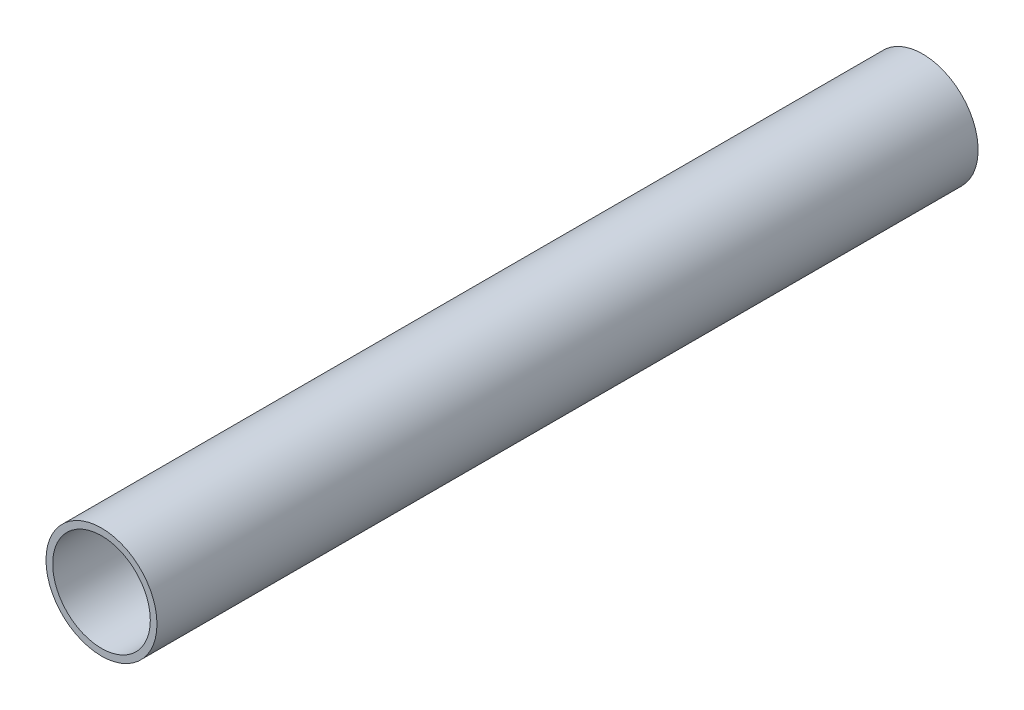
ISO-10303-21;
HEADER;
FILE_DESCRIPTION(('STEP AP214'),'2;1');
FILE_NAME('part.step','',(''),(''),'','','');
FILE_SCHEMA(('AUTOMOTIVE_DESIGN { 1 0 10303 214 1 1 1 1 }'));
ENDSEC;
DATA;
#1=APPLICATION_CONTEXT('core data for automotive mechanical design processes');
#2=APPLICATION_PROTOCOL_DEFINITION('international standard','automotive_design',2000,#1);
#3=PRODUCT_CONTEXT('',#1,'mechanical');
#4=PRODUCT('Part','Part','',(#3));
#5=PRODUCT_RELATED_PRODUCT_CATEGORY('part','',(#4));
#6=PRODUCT_DEFINITION_FORMATION('','',#4);
#7=PRODUCT_DEFINITION_CONTEXT('part definition',#1,'design');
#8=PRODUCT_DEFINITION('design','',#6,#7);
#9=PRODUCT_DEFINITION_SHAPE('','',#8);
#10=(LENGTH_UNIT() NAMED_UNIT(*) SI_UNIT(.MILLI.,.METRE.));
#11=(NAMED_UNIT(*) PLANE_ANGLE_UNIT() SI_UNIT($,.RADIAN.));
#12=(NAMED_UNIT(*) SI_UNIT($,.STERADIAN.) SOLID_ANGLE_UNIT());
#13=UNCERTAINTY_MEASURE_WITH_UNIT(LENGTH_MEASURE(1.E-05),#10,'distance_accuracy_value','');
#14=(GEOMETRIC_REPRESENTATION_CONTEXT(3) GLOBAL_UNCERTAINTY_ASSIGNED_CONTEXT((#13)) GLOBAL_UNIT_ASSIGNED_CONTEXT((#10,
#11,#12)) REPRESENTATION_CONTEXT('',''));
#15=CARTESIAN_POINT('',(0.,0.,0.));
#16=DIRECTION('',(0.,0.,1.));
#17=DIRECTION('',(1.,0.,0.));
#18=AXIS2_PLACEMENT_3D('',#15,#16,#17);
#19=CARTESIAN_POINT('',(0.,0.,235.43));
#20=DIRECTION('',(0.,0.,-1.));
#21=DIRECTION('',(-1.,0.,0.));
#22=AXIS2_PLACEMENT_3D('',#19,#20,#21);
#23=CYLINDRICAL_SURFACE('',#22,12.5);
#24=CARTESIAN_POINT('',(0.,0.,-19.57));
#25=DIRECTION('',(0.,0.,-1.));
#26=DIRECTION('',(-1.,0.,0.));
#27=AXIS2_PLACEMENT_3D('',#24,#25,#26);
#28=CIRCLE('',#27,12.5);
#29=CARTESIAN_POINT('',(-12.5,0.,-19.57));
#30=VERTEX_POINT('',#29);
#31=EDGE_CURVE('E10',#30,#30,#28,.T.);
#32=ORIENTED_EDGE('',*,*,#31,.F.);
#33=EDGE_LOOP('',(#32));
#34=FACE_BOUND('',#33,.T.);
#35=CARTESIAN_POINT('',(0.,0.,165.43));
#36=DIRECTION('',(0.,0.,1.));
#37=DIRECTION('',(1.,0.,0.));
#38=AXIS2_PLACEMENT_3D('',#35,#36,#37);
#39=CIRCLE('',#38,12.5);
#40=CARTESIAN_POINT('',(12.5,0.,165.43));
#41=VERTEX_POINT('',#40);
#42=EDGE_CURVE('E42',#41,#41,#39,.T.);
#43=ORIENTED_EDGE('',*,*,#42,.F.);
#44=EDGE_LOOP('',(#43));
#45=FACE_BOUND('',#44,.T.);
#46=ADVANCED_FACE('F36',(#34,#45),#23,.T.);
#47=CARTESIAN_POINT('',(1.22546035237292,2.32941642090623,-19.57));
#48=DIRECTION('',(0.,0.,-1.));
#49=DIRECTION('',(-1.,0.,0.));
#50=AXIS2_PLACEMENT_3D('',#47,#48,#49);
#51=PLANE('',#50);
#52=CARTESIAN_POINT('',(0.,0.,-19.57));
#53=DIRECTION('',(0.,0.,-1.));
#54=DIRECTION('',(-1.,0.,0.));
#55=AXIS2_PLACEMENT_3D('',#52,#53,#54);
#56=CIRCLE('',#55,11.);
#57=CARTESIAN_POINT('',(-11.,0.,-19.57));
#58=VERTEX_POINT('',#57);
#59=EDGE_CURVE('E46',#58,#58,#56,.T.);
#60=ORIENTED_EDGE('',*,*,#59,.F.);
#61=EDGE_LOOP('',(#60));
#62=FACE_BOUND('',#61,.T.);
#63=ORIENTED_EDGE('',*,*,#31,.T.);
#64=EDGE_LOOP('',(#63));
#65=FACE_BOUND('',#64,.T.);
#66=ADVANCED_FACE('F60',(#62,#65),#51,.T.);
#67=CARTESIAN_POINT('',(-6.06455242149195,3.81714778916376,165.43));
#68=DIRECTION('',(0.,0.,1.));
#69=DIRECTION('',(1.,0.,0.));
#70=AXIS2_PLACEMENT_3D('',#67,#68,#69);
#71=PLANE('',#70);
#72=CARTESIAN_POINT('',(0.,0.,165.43));
#73=DIRECTION('',(0.,0.,1.));
#74=DIRECTION('',(1.,0.,0.));
#75=AXIS2_PLACEMENT_3D('',#72,#73,#74);
#76=CIRCLE('',#75,11.);
#77=CARTESIAN_POINT('',(11.,0.,165.43));
#78=VERTEX_POINT('',#77);
#79=EDGE_CURVE('E50',#78,#78,#76,.T.);
#80=ORIENTED_EDGE('',*,*,#79,.F.);
#81=EDGE_LOOP('',(#80));
#82=FACE_BOUND('',#81,.T.);
#83=ORIENTED_EDGE('',*,*,#42,.T.);
#84=EDGE_LOOP('',(#83));
#85=FACE_BOUND('',#84,.T.);
#86=ADVANCED_FACE('F58',(#82,#85),#71,.T.);
#87=CARTESIAN_POINT('',(0.,0.,-158.57));
#88=DIRECTION('',(0.,0.,1.));
#89=DIRECTION('',(1.,0.,0.));
#90=AXIS2_PLACEMENT_3D('',#87,#88,#89);
#91=CYLINDRICAL_SURFACE('',#90,11.);
#92=ORIENTED_EDGE('',*,*,#59,.T.);
#93=EDGE_LOOP('',(#92));
#94=FACE_BOUND('',#93,.T.);
#95=ORIENTED_EDGE('',*,*,#79,.T.);
#96=EDGE_LOOP('',(#95));
#97=FACE_BOUND('',#96,.T.);
#98=ADVANCED_FACE('F56',(#94,#97),#91,.F.);
#99=CLOSED_SHELL('',(#46,#66,#86,#98));
#100=MANIFOLD_SOLID_BREP('B2',#99);
#101=ADVANCED_BREP_SHAPE_REPRESENTATION('',(#18,#100),#14);
#102=SHAPE_DEFINITION_REPRESENTATION(#9,#101);
ENDSEC;
END-ISO-10303-21;
